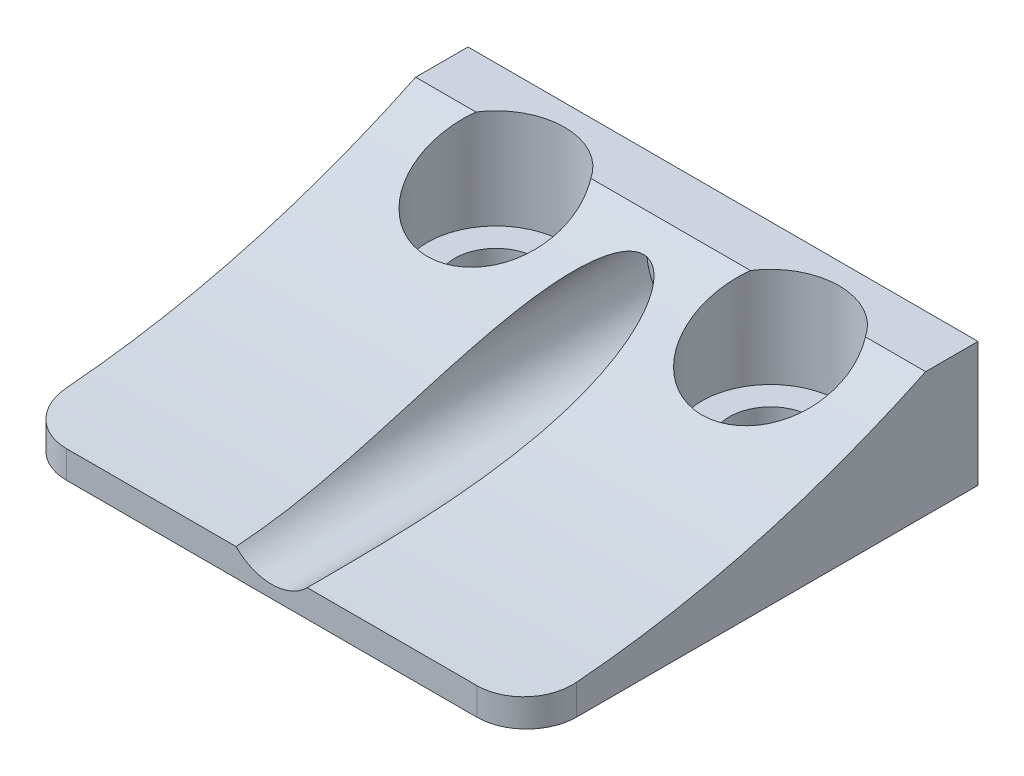
ISO-10303-21;
HEADER;
FILE_DESCRIPTION(('STEP AP214'),'2;1');
FILE_NAME('part.step','',(''),(''),'','','');
FILE_SCHEMA(('AUTOMOTIVE_DESIGN { 1 0 10303 214 1 1 1 1 }'));
ENDSEC;
DATA;
#1=APPLICATION_CONTEXT('core data for automotive mechanical design processes');
#2=APPLICATION_PROTOCOL_DEFINITION('international standard','automotive_design',2000,#1);
#3=PRODUCT_CONTEXT('',#1,'mechanical');
#4=PRODUCT('Part','Part','',(#3));
#5=PRODUCT_RELATED_PRODUCT_CATEGORY('part','',(#4));
#6=PRODUCT_DEFINITION_FORMATION('','',#4);
#7=PRODUCT_DEFINITION_CONTEXT('part definition',#1,'design');
#8=PRODUCT_DEFINITION('design','',#6,#7);
#9=PRODUCT_DEFINITION_SHAPE('','',#8);
#10=(LENGTH_UNIT() NAMED_UNIT(*) SI_UNIT(.MILLI.,.METRE.));
#11=(NAMED_UNIT(*) PLANE_ANGLE_UNIT() SI_UNIT($,.RADIAN.));
#12=(NAMED_UNIT(*) SI_UNIT($,.STERADIAN.) SOLID_ANGLE_UNIT());
#13=UNCERTAINTY_MEASURE_WITH_UNIT(LENGTH_MEASURE(1.E-05),#10,'distance_accuracy_value','');
#14=(GEOMETRIC_REPRESENTATION_CONTEXT(3) GLOBAL_UNCERTAINTY_ASSIGNED_CONTEXT((#13)) GLOBAL_UNIT_ASSIGNED_CONTEXT((#10,
#11,#12)) REPRESENTATION_CONTEXT('',''));
#15=CARTESIAN_POINT('',(0.,0.,0.));
#16=DIRECTION('',(0.,0.,1.));
#17=DIRECTION('',(1.,0.,0.));
#18=AXIS2_PLACEMENT_3D('',#15,#16,#17);
#19=CARTESIAN_POINT('',(26.8144544816881,41.0798408542344,10.3197737082196));
#20=DIRECTION('',(-1.,0.,0.));
#21=DIRECTION('',(0.,0.,1.));
#22=AXIS2_PLACEMENT_3D('',#19,#20,#21);
#23=CYLINDRICAL_SURFACE('',#22,40.);
#24=CARTESIAN_POINT('',(-10.225,41.0798408542344,10.3197737082196));
#25=DIRECTION('',(1.,0.,0.));
#26=DIRECTION('',(0.,0.,-1.));
#27=AXIS2_PLACEMENT_3D('',#24,#25,#26);
#28=CIRCLE('',#27,40.);
#29=CARTESIAN_POINT('',(-10.225,5.,-6.95));
#30=VERTEX_POINT('',#29);
#31=CARTESIAN_POINT('',(-10.225,1.21370760937314,7.05));
#32=VERTEX_POINT('',#31);
#33=EDGE_CURVE('E269',#30,#32,#28,.F.);
#34=ORIENTED_EDGE('',*,*,#33,.T.);
#35=CARTESIAN_POINT('',(-10.225,1.21370760937314,7.05));
#36=CARTESIAN_POINT('',(-10.224999565269,1.20909585036772,7.10621994124016));
#37=CARTESIAN_POINT('',(-10.2226279770161,1.2046066653164,7.16242321877067));
#38=CARTESIAN_POINT('',(-10.2131613711471,1.19589483553528,7.27444956414878));
#39=CARTESIAN_POINT('',(-10.2060664907608,1.19167218306558,7.330272642995));
#40=CARTESIAN_POINT('',(-10.1777543630685,1.17944838853864,7.49648393095205));
#41=CARTESIAN_POINT('',(-10.1495094883465,1.17187695426911,7.60579095520703));
#42=CARTESIAN_POINT('',(-10.0750218784631,1.15799943716217,7.81818524735456));
#43=CARTESIAN_POINT('',(-10.0287688553663,1.15169408075327,7.92126892093522));
#44=CARTESIAN_POINT('',(-9.91956076375945,1.14034941223615,8.11823871763709));
#45=CARTESIAN_POINT('',(-9.85660937024634,1.13530982203117,8.2121268583043));
#46=CARTESIAN_POINT('',(-9.71593411931338,1.12642693325025,8.38781758096311));
#47=CARTESIAN_POINT('',(-9.63824241378423,1.12258107812708,8.46964579063515));
#48=CARTESIAN_POINT('',(-9.47017869703432,1.11593922463981,8.6191327553429));
#49=CARTESIAN_POINT('',(-9.3798041310868,1.11314343821072,8.68678864876765));
#50=CARTESIAN_POINT('',(-9.18905553707292,1.1084536656538,8.80591436014459));
#51=CARTESIAN_POINT('',(-9.08869051600929,1.10655887596997,8.85739858686994));
#52=CARTESIAN_POINT('',(-8.88075570199277,1.10352648950776,8.94277481571343));
#53=CARTESIAN_POINT('',(-8.77319020049853,1.10238844605689,8.97667719298262));
#54=CARTESIAN_POINT('',(-8.59163817626508,1.10104239240878,9.01749320600612));
#55=CARTESIAN_POINT('',(-8.51879388746574,1.10064925249004,9.02967584877185));
#56=CARTESIAN_POINT('',(-8.37230991015651,1.10012929471929,9.04592818474137));
#57=CARTESIAN_POINT('',(-8.29867149869278,1.10000209929868,9.05000937937264));
#58=CARTESIAN_POINT('',(-8.225,1.09999999999999,9.05));
#59=B_SPLINE_CURVE_WITH_KNOTS('',3,(#35,#36,#37,#38,#39,#40,#41,#42,#43,#44,#45,#46,#47,#48,#49,
#50,#51,#52,#53,#54,#55,#56,#57,#58),.UNSPECIFIED.,.F.,.F.,(4,2,2,2,2,2,2,2,2,2,2,4),(0.,
0.169123231588352,0.338241549712069,0.675952878848622,1.0138574239882,1.35168766431087,
1.68878932168249,2.02595897964928,2.36282736546034,2.69949673644177,2.92064791953666,
3.14148491453194),.UNSPECIFIED.);
#60=CARTESIAN_POINT('',(-8.225,1.1,9.05));
#61=VERTEX_POINT('',#60);
#62=EDGE_CURVE('E60',#32,#61,#59,.T.);
#63=ORIENTED_EDGE('',*,*,#62,.T.);
#64=DIRECTION('',(-1.,0.,0.));
#65=VECTOR('',#64,1.);
#66=CARTESIAN_POINT('',(26.8144544816881,1.1,9.05));
#67=LINE('',#66,#65);
#68=CARTESIAN_POINT('',(-1.42828568570857,1.1,9.05));
#69=VERTEX_POINT('',#68);
#70=EDGE_CURVE('E146',#69,#61,#67,.T.);
#71=ORIENTED_EDGE('',*,*,#70,.F.);
#72=CARTESIAN_POINT('',(-1.42828568570857,1.1,9.04999999999998));
#73=CARTESIAN_POINT('',(-1.43345831726101,1.10528274764739,8.88366578477089));
#74=CARTESIAN_POINT('',(-1.43960156534336,1.11160261980214,8.71739886352551));
#75=CARTESIAN_POINT('',(-1.45364659543174,1.12631210238598,8.38503648361444));
#76=CARTESIAN_POINT('',(-1.46154831550012,1.13470163991756,8.21894101911658));
#77=CARTESIAN_POINT('',(-1.4876159165999,1.1629665966577,7.72098577616618));
#78=CARTESIAN_POINT('',(-1.50814544695503,1.18593951471559,7.38942083783333));
#79=CARTESIAN_POINT('',(-1.55383778322959,1.24029696100988,6.72496628677546));
#80=CARTESIAN_POINT('',(-1.57903200545506,1.27173922497099,6.39208363986475));
#81=CARTESIAN_POINT('',(-1.63191601341477,1.34292792190875,5.72744861248274));
#82=CARTESIAN_POINT('',(-1.65960561303224,1.38267373585932,5.39569614962934));
#83=CARTESIAN_POINT('',(-1.743745960221,1.51495301943622,4.39759259258863));
#84=CARTESIAN_POINT('',(-1.80090305923371,1.62015976457516,3.73290598740112));
#85=CARTESIAN_POINT('',(-1.87587225788762,1.8032467940516,2.73935473840345));
#86=CARTESIAN_POINT('',(-1.89907952105383,1.86854088719541,2.40853016683811));
#87=CARTESIAN_POINT('',(-1.93977903138408,2.00755297126522,1.74830286964103));
#88=CARTESIAN_POINT('',(-1.95727166314166,2.08127039485191,1.41890004979864));
#89=CARTESIAN_POINT('',(-1.98417149373306,2.23680153712152,0.763025925678702));
#90=CARTESIAN_POINT('',(-1.99361012399729,2.31858237973707,0.436548191361649));
#91=CARTESIAN_POINT('',(-2.0018258407399,2.49039026087254,-0.21434160815485));
#92=CARTESIAN_POINT('',(-2.00060436576562,2.58041618512248,-0.538753946160288));
#93=CARTESIAN_POINT('',(-1.98416220533394,2.76834631543846,-1.18422737234577));
#94=CARTESIAN_POINT('',(-1.9689731389906,2.86623227176228,-1.50529437397032));
#95=CARTESIAN_POINT('',(-1.93225750325255,3.01874142609825,-1.9839153586153));
#96=CARTESIAN_POINT('',(-1.91770185105954,3.07051207977863,-2.14292323299014));
#97=CARTESIAN_POINT('',(-1.88316120295797,3.17585866861077,-2.45974040831774));
#98=CARTESIAN_POINT('',(-1.86317698671937,3.22943434355166,-2.61754987804649));
#99=CARTESIAN_POINT('',(-1.82721804829365,3.31383926036287,-2.86117941131167));
#100=CARTESIAN_POINT('',(-1.81346732910393,3.34408906063101,-2.94753103957428));
#101=CARTESIAN_POINT('',(-1.78381938859837,3.4050616678414,-3.11969628963927));
#102=CARTESIAN_POINT('',(-1.767922183316,3.43578447124896,-3.20550991545531));
#103=CARTESIAN_POINT('',(-1.71665242199466,3.52865131126534,-3.46214432768812));
#104=CARTESIAN_POINT('',(-1.6777189839569,3.59145171831719,-3.63203731350148));
#105=CARTESIAN_POINT('',(-1.58812690150938,3.71814793187251,-3.96784190068478));
#106=CARTESIAN_POINT('',(-1.53750028959664,3.78204031208811,-4.13376303652438));
#107=CARTESIAN_POINT('',(-1.45010606986131,3.87805813160157,-4.3783572144136));
#108=CARTESIAN_POINT('',(-1.41908601093897,3.91007611768269,-4.4591303553968));
#109=CARTESIAN_POINT('',(-1.35259101019348,3.97398464588677,-4.6188613803396));
#110=CARTESIAN_POINT('',(-1.31711761635361,4.00587522833999,-4.69781988384027));
#111=CARTESIAN_POINT('',(-1.24917687676714,4.06238963826521,-4.83650017354847));
#112=CARTESIAN_POINT('',(-1.21772220776435,4.08709152790516,-4.89668481621298));
#113=CARTESIAN_POINT('',(-1.15109486101141,4.13605998851927,-5.01519168113801));
#114=CARTESIAN_POINT('',(-1.11592096064959,4.16032641325886,-5.0735132827117));
#115=CARTESIAN_POINT('',(-1.0414196598229,4.20803839319925,-5.18744981341687));
#116=CARTESIAN_POINT('',(-1.0021091624353,4.23148680482393,-5.24307449755149));
#117=CARTESIAN_POINT('',(-0.918540678230515,4.27723150771583,-5.35094321830111));
#118=CARTESIAN_POINT('',(-0.874287434024683,4.29952887388302,-5.4031904209067));
#119=CARTESIAN_POINT('',(-0.784043466693336,4.34052038686223,-5.49872165103629));
#120=CARTESIAN_POINT('',(-0.738531528249398,4.35935944697161,-5.54239008361488));
#121=CARTESIAN_POINT('',(-0.641945766257033,4.39487581983737,-5.62435798838894));
#122=CARTESIAN_POINT('',(-0.590865571066904,4.41155060725766,-5.66265119278162));
#123=CARTESIAN_POINT('',(-0.481959382384046,4.44189555566455,-5.73209286775474));
#124=CARTESIAN_POINT('',(-0.424043721309748,4.45551691314017,-5.76312559327037));
#125=CARTESIAN_POINT('',(-0.302667171812502,4.47791563562314,-5.81403746543239));
#126=CARTESIAN_POINT('',(-0.239228643648722,4.48671156883164,-5.83395937143424));
#127=CARTESIAN_POINT('',(-0.128866085902907,4.49636416666584,-5.85580436553776));
#128=CARTESIAN_POINT('',(-0.0827939039144372,4.49882259946486,-5.86136052528585));
#129=CARTESIAN_POINT('',(0.00971761957873079,4.50050982733777,-5.86517450679411));
#130=CARTESIAN_POINT('',(0.0561568570970288,4.49973950653721,-5.86343432650185));
#131=CARTESIAN_POINT('',(0.147919031716032,4.49505122958689,-5.85283271165214));
#132=CARTESIAN_POINT('',(0.193244307972157,4.49114057762425,-5.84398780217582));
#133=CARTESIAN_POINT('',(0.281838875681935,4.48054621485097,-5.819984716319));
#134=CARTESIAN_POINT('',(0.325106595927557,4.47386042159441,-5.80482179891823));
#135=CARTESIAN_POINT('',(0.427987986397958,4.45465368655782,-5.76116081309164));
#136=CARTESIAN_POINT('',(0.486112930613233,4.44086155108058,-5.72973374977497));
#137=CARTESIAN_POINT('',(0.596280401001137,4.40990782451347,-5.65888413503976));
#138=CARTESIAN_POINT('',(0.648306153953162,4.39273727406901,-5.61944031428224));
#139=CARTESIAN_POINT('',(0.739322013484568,4.35886904436732,-5.54124045318868));
#140=CARTESIAN_POINT('',(0.779100882907556,4.34247930515494,-5.50325093973279));
#141=CARTESIAN_POINT('',(0.854953178683813,4.30852977758407,-5.42419467162673));
#142=CARTESIAN_POINT('',(0.891023773097572,4.29096911163637,-5.38312560596795));
#143=CARTESIAN_POINT('',(0.994403302595701,4.2370203969623,-5.25632905590302));
#144=CARTESIAN_POINT('',(1.05677713660415,4.19940662148313,-5.16710650897162));
#145=CARTESIAN_POINT('',(1.1747683731275,4.12026523123181,-4.9773190119255));
#146=CARTESIAN_POINT('',(1.22971709521284,4.07864008072712,-4.87639365451039));
#147=CARTESIAN_POINT('',(1.33051703101936,3.99466452524144,-4.67029300781556));
#148=CARTESIAN_POINT('',(1.37635795330129,3.95231335790794,-4.56511307068149));
#149=CARTESIAN_POINT('',(1.46070459861849,3.86745189406069,-4.3516725286342));
#150=CARTESIAN_POINT('',(1.49919486130271,3.82494144979725,-4.24340596929308));
#151=CARTESIAN_POINT('',(1.56998247929754,3.74023894823175,-4.02483750607417));
#152=CARTESIAN_POINT('',(1.60228285525493,3.69804674533531,-3.91453662389705));
#153=CARTESIAN_POINT('',(1.6793587249136,3.58926144023566,-3.62627515771558));
#154=CARTESIAN_POINT('',(1.72012837687746,3.5230803337256,-3.44709014601791));
#155=CARTESIAN_POINT('',(1.79127477763523,3.39265656986616,-3.08593629898127));
#156=CARTESIAN_POINT('',(1.82164628912416,3.32841490417807,-2.90396610887423));
#157=CARTESIAN_POINT('',(1.87395740829673,3.20211223293134,-2.53772453838192));
#158=CARTESIAN_POINT('',(1.89588216030466,3.14005524219268,-2.3534496868659));
#159=CARTESIAN_POINT('',(1.93268108731261,3.01843664764704,-1.98337465392338));
#160=CARTESIAN_POINT('',(1.94755449277604,2.95887531684593,-1.79757430826463));
#161=CARTESIAN_POINT('',(1.97146899940612,2.84190873141882,-1.42327958364731));
#162=CARTESIAN_POINT('',(1.980462082028,2.78452474663924,-1.23477556322814));
#163=CARTESIAN_POINT('',(1.99334262481752,2.67250495855853,-0.856782925367288));
#164=CARTESIAN_POINT('',(1.99722990238961,2.61786925360952,-0.667294272956145));
#165=CARTESIAN_POINT('',(2.00240242931624,2.45828023642312,-0.0980113524981178));
#166=CARTESIAN_POINT('',(1.99722182324333,2.35751195684811,0.283025655949766));
#167=CARTESIAN_POINT('',(1.9754493581197,2.17562827611849,1.01430846793045));
#168=CARTESIAN_POINT('',(1.9598869446393,2.09356623210469,1.36435636248168));
#169=CARTESIAN_POINT('',(1.92135349252679,1.93897696213034,2.06617517340787));
#170=CARTESIAN_POINT('',(1.89838167326923,1.86645074195999,2.41794626748485));
#171=CARTESIAN_POINT('',(1.84762383783641,1.73089366696528,3.12328474745598));
#172=CARTESIAN_POINT('',(1.8198334878335,1.66787145636359,3.4768534698627));
#173=CARTESIAN_POINT('',(1.76192507792078,1.55139679002774,4.18536284822354));
#174=CARTESIAN_POINT('',(1.73180705892793,1.49794416612926,4.54030347995739));
#175=CARTESIAN_POINT('',(1.67268104936572,1.40218342083921,5.23999831740106));
#176=CARTESIAN_POINT('',(1.6436686767473,1.35957063916993,5.58471047591311));
#177=CARTESIAN_POINT('',(1.58805582524072,1.28332165310016,6.27530386978143));
#178=CARTESIAN_POINT('',(1.56145520845525,1.24968493525995,6.62118503712266));
#179=CARTESIAN_POINT('',(1.51298575499004,1.19144563664299,7.31369200369941));
#180=CARTESIAN_POINT('',(1.49111203265032,1.16683370943502,7.66031665648456));
#181=CARTESIAN_POINT('',(1.46340653472574,1.13668550066841,8.1809491415989));
#182=CARTESIAN_POINT('',(1.45502149555564,1.12776369387548,8.35463073256831));
#183=CARTESIAN_POINT('',(1.44016528608077,1.11218313603623,8.7021835175167));
#184=CARTESIAN_POINT('',(1.43369418967658,1.10552447237223,8.87605471855676));
#185=CARTESIAN_POINT('',(1.42828568570856,1.09999999999999,9.04999999999998));
#186=B_SPLINE_CURVE_WITH_KNOTS('',3,(#72,#73,#74,#75,#76,#77,#78,#79,#80,#81,#82,#83,#84,#85,
#86,#87,#88,#89,#90,#91,#92,#93,#94,#95,#96,#97,#98,#99,#100,#101,#102,#103,#104,#105,#106,#107,
#108,#109,#110,#111,#112,#113,#114,#115,#116,#117,#118,#119,#120,#121,#122,#123,#124,#125,#126,
#127,#128,#129,#130,#131,#132,#133,#134,#135,#136,#137,#138,#139,#140,#141,#142,#143,#144,#145,
#146,#147,#148,#149,#150,#151,#152,#153,#154,#155,#156,#157,#158,#159,#160,#161,#162,#163,#164,
#165,#166,#167,#168,#169,#170,#171,#172,#173,#174,#175,#176,#177,#178,#179,#180,#181,#182,#183,
#184,#185),.UNSPECIFIED.,.F.,.F.,(4,2,2,2,2,2,2,2,2,2,2,2,2,2,2,2,2,2,2,2,2,2,2,2,2,2,2,2,2,2,2,
2,2,2,2,2,2,2,2,2,2,2,2,2,2,2,2,2,2,2,2,2,2,2,2,2,4),(0.,0.499482147816068,0.99894670544052,
1.99776682538096,3.00357623251553,4.00931068373155,6.03438665064098,7.04828487685722,
8.06211485386563,9.07196993723258,10.0816887459706,11.0891274172057,11.5926175132957,
12.0960353345209,12.3735837902008,12.6511301728104,13.2066111804486,13.7605881722062,
14.0372695666372,14.3138550512825,14.5305425789178,14.747301560351,14.9632068899984,
15.178906807851,15.3760089505351,15.5733390488347,15.7736281013304,15.9731409380708,
16.1119158628408,16.2506527895305,16.3890679554314,16.5275871753808,16.7289434747596,
16.9308411366303,17.1027782924433,17.2748457929732,17.6194124905322,17.9855797982665,
18.3521585358511,18.719499991521,19.0866617265717,19.6721912727907,20.2580153044341,
20.844864996841,21.4317787193461,22.023427213744,22.6150968663023,23.7970979048847,
24.8765092338695,25.9560343224956,27.0365354299582,28.1170175481397,29.1625355265725,
30.2079936875187,31.252366051939,31.7746813758343,32.2970168645806),.UNSPECIFIED.);
#187=CARTESIAN_POINT('',(1.42828568570857,1.1,9.05));
#188=VERTEX_POINT('',#187);
#189=EDGE_CURVE('E133',#69,#188,#186,.T.);
#190=ORIENTED_EDGE('',*,*,#189,.T.);
#191=CARTESIAN_POINT('',(8.225,1.1,9.05));
#192=VERTEX_POINT('',#191);
#193=EDGE_CURVE('E148',#192,#188,#67,.T.);
#194=ORIENTED_EDGE('',*,*,#193,.F.);
#195=CARTESIAN_POINT('',(8.225,1.1,9.05));
#196=CARTESIAN_POINT('',(8.28123783851203,1.10000069503902,9.0499996382922));
#197=CARTESIAN_POINT('',(8.33744873846571,1.10007530672296,9.04762648841839));
#198=CARTESIAN_POINT('',(8.44946837304841,1.10037741223221,9.03815911289762));
#199=CARTESIAN_POINT('',(8.5052771266349,1.10060489880261,9.03106511128635));
#200=CARTESIAN_POINT('',(8.6714033194526,1.10152324484657,9.00276931999208));
#201=CARTESIAN_POINT('',(8.78060808405966,1.1024499605363,8.97455355666232));
#202=CARTESIAN_POINT('',(8.99272515975659,1.10502144070092,8.90020327600323));
#203=CARTESIAN_POINT('',(9.09563440136396,1.10666655230974,8.85406009721191));
#204=CARTESIAN_POINT('',(9.29223683963945,1.11080785059379,8.74517625611684));
#205=CARTESIAN_POINT('',(9.38593166768358,1.11330388626545,8.68243853909462));
#206=CARTESIAN_POINT('',(9.56143895958839,1.1192976158693,8.54216382752869));
#207=CARTESIAN_POINT('',(9.64325260899734,1.12279520975864,8.46462831135371));
#208=CARTESIAN_POINT('',(9.7927121362278,1.13093316543048,8.29695289907444));
#209=CARTESIAN_POINT('',(9.86035544211567,1.1355737343323,8.20681071978882));
#210=CARTESIAN_POINT('',(9.97956896871098,1.14609611400183,8.0164915418668));
#211=CARTESIAN_POINT('',(10.031133376255,1.15197837240392,7.91631093119329));
#212=CARTESIAN_POINT('',(10.1167030856152,1.16501071217477,7.70881382339418));
#213=CARTESIAN_POINT('',(10.1507177766453,1.17216011285752,7.60150117671851));
#214=CARTESIAN_POINT('',(10.1919583462806,1.18504847008534,7.41962777386215));
#215=CARTESIAN_POINT('',(10.2043445049042,1.19045474735005,7.34617117026092));
#216=CARTESIAN_POINT('',(10.2208643091675,1.20173833010579,7.19848023793793));
#217=CARTESIAN_POINT('',(10.225009912454,1.20761494019989,7.124247193476));
#218=CARTESIAN_POINT('',(10.225,1.21370760937315,7.05));
#219=B_SPLINE_CURVE_WITH_KNOTS('',3,(#195,#196,#197,#198,#199,#200,#201,#202,#203,#204,#205,
#206,#207,#208,#209,#210,#211,#212,#213,#214,#215,#216,#217,#218),.UNSPECIFIED.,.F.,.F.,(4,2,2,
2,2,2,2,2,2,2,2,4),(0.,0.168609898512986,0.337211795939221,0.673860565553855,1.01067218651971,
1.34742406854207,1.6841423250847,2.02092164352848,2.35782258034014,2.69454308554064,
2.91818010889533,3.14149238103),.UNSPECIFIED.);
#220=CARTESIAN_POINT('',(10.225,1.21370760937314,7.05));
#221=VERTEX_POINT('',#220);
#222=EDGE_CURVE('E67',#192,#221,#219,.T.);
#223=ORIENTED_EDGE('',*,*,#222,.T.);
#224=CARTESIAN_POINT('',(10.225,41.0798408542344,10.3197737082196));
#225=DIRECTION('',(-1.,0.,0.));
#226=DIRECTION('',(0.,0.,1.));
#227=AXIS2_PLACEMENT_3D('',#224,#225,#226);
#228=CIRCLE('',#227,40.);
#229=CARTESIAN_POINT('',(10.225,5.,-6.95));
#230=VERTEX_POINT('',#229);
#231=EDGE_CURVE('E155',#230,#221,#228,.T.);
#232=ORIENTED_EDGE('',*,*,#231,.F.);
#233=DIRECTION('',(-1.,0.,0.));
#234=VECTOR('',#233,1.);
#235=CARTESIAN_POINT('',(26.8144544816881,5.,-6.95));
#236=LINE('',#235,#234);
#237=CARTESIAN_POINT('',(7.80988611432322,5.,-6.95000000000001));
#238=VERTEX_POINT('',#237);
#239=EDGE_CURVE('E153',#230,#238,#236,.T.);
#240=ORIENTED_EDGE('',*,*,#239,.T.);
#241=CARTESIAN_POINT('',(3.20011388567677,4.99999999999999,-6.94999999999999));
#242=CARTESIAN_POINT('',(3.10779866397329,4.93209165334479,-6.80822172851224));
#243=CARTESIAN_POINT('',(3.02926599130279,4.86167328361176,-6.65886943729974));
#244=CARTESIAN_POINT('',(2.90089500401192,4.71827662765504,-6.34950333377037));
#245=CARTESIAN_POINT('',(2.85104570987861,4.6452993323088,-6.18949362713602));
#246=CARTESIAN_POINT('',(2.78111000864243,4.49921359759096,-5.86323829092861));
#247=CARTESIAN_POINT('',(2.76101366958933,4.4261052101426,-5.69699476130129));
#248=CARTESIAN_POINT('',(2.75130655889453,4.28185682375574,-5.36274609269866));
#249=CARTESIAN_POINT('',(2.7616949708726,4.21071677215679,-5.19474100101797));
#250=CARTESIAN_POINT('',(2.81346903168424,4.07209813698924,-4.86112740656574));
#251=CARTESIAN_POINT('',(2.85498483936764,4.0046362076777,-4.6955319520169));
#252=CARTESIAN_POINT('',(2.9689540525298,3.87558636849556,-4.37286487243274));
#253=CARTESIAN_POINT('',(3.04140143687738,3.81399731826507,-4.21579159517644));
#254=CARTESIAN_POINT('',(3.21166029951945,3.70133062913292,-3.92348150839035));
#255=CARTESIAN_POINT('',(3.30802268686657,3.64988142328866,-3.78754560232227));
#256=CARTESIAN_POINT('',(3.52548475885381,3.5552168602135,-3.53378006505748));
#257=CARTESIAN_POINT('',(3.64657268183942,3.51199760690935,-3.41594187151093));
#258=CARTESIAN_POINT('',(3.90079902173721,3.43766455426554,-3.21084555192685));
#259=CARTESIAN_POINT('',(4.0324833819884,3.40591158251056,-3.12201594260594));
#260=CARTESIAN_POINT('',(4.31060916997589,3.35125255225742,-2.9678276477648));
#261=CARTESIAN_POINT('',(4.45704498763397,3.32834314638868,-2.90246008230535));
#262=CARTESIAN_POINT('',(4.75116963300586,3.29297689027877,-2.80103569337132));
#263=CARTESIAN_POINT('',(4.8982795953528,3.27998510189306,-2.76348269656799));
#264=CARTESIAN_POINT('',(5.19715973088041,3.26257987464164,-2.71308861110631));
#265=CARTESIAN_POINT('',(5.34892885612858,3.25816452092891,-2.70024200629715));
#266=CARTESIAN_POINT('',(5.64770580268482,3.25800305337454,-2.69977221051975));
#267=CARTESIAN_POINT('',(5.79471298154283,3.26198818611437,-2.71136707340704));
#268=CARTESIAN_POINT('',(6.0845550965828,3.27800640817164,-2.75776071223185));
#269=CARTESIAN_POINT('',(6.22739027816862,3.29003902312374,-2.79255812047623));
#270=CARTESIAN_POINT('',(6.50470691657403,3.32189108463112,-2.88399653283538));
#271=CARTESIAN_POINT('',(6.63920065903032,3.34169874840911,-2.94060448156159));
#272=CARTESIAN_POINT('',(6.89656499422387,3.38871253571866,-3.07365014378018));
#273=CARTESIAN_POINT('',(7.01943461347853,3.41591927816106,-3.15008951608733));
#274=CARTESIAN_POINT('',(7.25372254389466,3.47802549257966,-3.32251620269309));
#275=CARTESIAN_POINT('',(7.36474544404151,3.51311168069167,-3.41897272791181));
#276=CARTESIAN_POINT('',(7.56900774167376,3.58981460971624,-3.62691765461101));
#277=CARTESIAN_POINT('',(7.66224346542065,3.63143269648975,-3.73840915329515));
#278=CARTESIAN_POINT('',(7.83348189669691,3.7226473645022,-3.97908841003803));
#279=CARTESIAN_POINT('',(7.91046218419578,3.77254305668675,-4.10888946037476));
#280=CARTESIAN_POINT('',(8.04166798150675,3.87755676463947,-4.37753447200291));
#281=CARTESIAN_POINT('',(8.09588819145175,3.93267599309153,-4.51638053081195));
#282=CARTESIAN_POINT('',(8.1838258086445,4.05074220975812,-4.8087517421709));
#283=CARTESIAN_POINT('',(8.21595916757449,4.11396562250554,-4.96264159834229));
#284=CARTESIAN_POINT('',(8.25369584693908,4.24355056405972,-5.27240190254801));
#285=CARTESIAN_POINT('',(8.25928253453897,4.30991403398338,-5.42827353096404));
#286=CARTESIAN_POINT('',(8.2437993846098,4.44830493391069,-5.74766860509562));
#287=CARTESIAN_POINT('',(8.22105982963916,4.5204288450348,-5.91106919397246));
#288=CARTESIAN_POINT('',(8.14679723301123,4.66426443382293,-6.23125435224169));
#289=CARTESIAN_POINT('',(8.09530661366071,4.73597648407268,-6.38804616047509));
#290=CARTESIAN_POINT('',(7.99933559951567,4.83937644606437,-6.61052321143727));
#291=CARTESIAN_POINT('',(7.96558282419002,4.87214887363576,-6.68048474015352));
#292=CARTESIAN_POINT('',(7.89215120583807,4.93679300584378,-6.8174903987478));
#293=CARTESIAN_POINT('',(7.85248187854706,4.96866606082832,-6.88453899397435));
#294=CARTESIAN_POINT('',(7.80988611432323,4.99999999999999,-6.94999999999999));
#295=B_SPLINE_CURVE_WITH_KNOTS('',3,(#241,#242,#243,#244,#245,#246,#247,#248,#249,#250,#251,
#252,#253,#254,#255,#256,#257,#258,#259,#260,#261,#262,#263,#264,#265,#266,#267,#268,#269,#270,
#271,#272,#273,#274,#275,#276,#277,#278,#279,#280,#281,#282,#283,#284,#285,#286,#287,#288,#289,
#290,#291,#292,#293,#294),.UNSPECIFIED.,.F.,.F.,(4,2,2,2,2,2,2,2,2,2,2,2,2,2,2,2,2,2,2,2,2,2,2,
2,2,2,4),(0.,0.546021025867853,1.09183290482731,1.63746254307725,2.18307756952408,
2.73098689227693,3.27878960776272,3.79920608849536,4.31937558736238,4.80282565277004,
5.28609254805728,5.74097226142486,6.1957504028378,6.63620013334582,7.0766239034766,
7.51638278988413,7.95617847213027,8.40776716584491,8.85944902931807,9.33422195621584,
9.80910537656269,10.3152397326285,10.8216911657371,11.3594599516623,11.8966235219533,
12.1493239910751,12.4016223331753),.UNSPECIFIED.);
#296=CARTESIAN_POINT('',(3.20011388567679,5.,-6.95));
#297=VERTEX_POINT('',#296);
#298=EDGE_CURVE('E192',#297,#238,#295,.T.);
#299=ORIENTED_EDGE('',*,*,#298,.F.);
#300=CARTESIAN_POINT('',(-3.20011388567678,5.,-6.95000000000001));
#301=VERTEX_POINT('',#300);
#302=EDGE_CURVE('E157',#297,#301,#236,.T.);
#303=ORIENTED_EDGE('',*,*,#302,.T.);
#304=CARTESIAN_POINT('',(-7.80988611432323,4.99999999999999,-6.94999999999999));
#305=CARTESIAN_POINT('',(-7.90220133602671,4.93209165334477,-6.80822172851225));
#306=CARTESIAN_POINT('',(-7.98073400869721,4.86167328361175,-6.65886943729975));
#307=CARTESIAN_POINT('',(-8.10910499598808,4.71827662765503,-6.34950333377038));
#308=CARTESIAN_POINT('',(-8.15895429012139,4.6452993323088,-6.18949362713602));
#309=CARTESIAN_POINT('',(-8.22888999135757,4.49921359759097,-5.86323829092861));
#310=CARTESIAN_POINT('',(-8.24898633041067,4.4261052101426,-5.69699476130129));
#311=CARTESIAN_POINT('',(-8.25869344110547,4.28185682375574,-5.36274609269866));
#312=CARTESIAN_POINT('',(-8.2483050291274,4.21071677215679,-5.19474100101797));
#313=CARTESIAN_POINT('',(-8.19653096831576,4.07209813698924,-4.86112740656574));
#314=CARTESIAN_POINT('',(-8.15501516063236,4.00463620767769,-4.69553195201691));
#315=CARTESIAN_POINT('',(-8.04104594747021,3.87558636849555,-4.37286487243275));
#316=CARTESIAN_POINT('',(-7.96859856312263,3.81399731826507,-4.21579159517644));
#317=CARTESIAN_POINT('',(-7.79833970048055,3.70133062913293,-3.92348150839035));
#318=CARTESIAN_POINT('',(-7.70197731313343,3.64988142328866,-3.78754560232227));
#319=CARTESIAN_POINT('',(-7.4845152411462,3.5552168602135,-3.53378006505748));
#320=CARTESIAN_POINT('',(-7.36342731816059,3.51199760690935,-3.41594187151093));
#321=CARTESIAN_POINT('',(-7.1092009782628,3.43766455426554,-3.21084555192685));
#322=CARTESIAN_POINT('',(-6.97751661801161,3.40591158251056,-3.12201594260595));
#323=CARTESIAN_POINT('',(-6.69939083002411,3.35125255225742,-2.9678276477648));
#324=CARTESIAN_POINT('',(-6.55295501236603,3.32834314638868,-2.90246008230535));
#325=CARTESIAN_POINT('',(-6.25883036699414,3.29297689027876,-2.80103569337132));
#326=CARTESIAN_POINT('',(-6.11172040464721,3.27998510189306,-2.76348269656799));
#327=CARTESIAN_POINT('',(-5.81284026911959,3.26257987464165,-2.71308861110631));
#328=CARTESIAN_POINT('',(-5.66107114387143,3.25816452092891,-2.70024200629715));
#329=CARTESIAN_POINT('',(-5.36229419731518,3.25800305337455,-2.69977221051975));
#330=CARTESIAN_POINT('',(-5.21528701845718,3.26198818611437,-2.71136707340704));
#331=CARTESIAN_POINT('',(-4.9254449034172,3.27800640817164,-2.75776071223185));
#332=CARTESIAN_POINT('',(-4.78260972183139,3.29003902312374,-2.79255812047622));
#333=CARTESIAN_POINT('',(-4.50529308342598,3.32189108463112,-2.88399653283537));
#334=CARTESIAN_POINT('',(-4.37079934096968,3.34169874840912,-2.94060448156159));
#335=CARTESIAN_POINT('',(-4.11343500577613,3.38871253571866,-3.07365014378017));
#336=CARTESIAN_POINT('',(-3.99056538652147,3.41591927816106,-3.15008951608733));
#337=CARTESIAN_POINT('',(-3.75627745610535,3.47802549257966,-3.32251620269309));
#338=CARTESIAN_POINT('',(-3.64525455595849,3.51311168069167,-3.41897272791181));
#339=CARTESIAN_POINT('',(-3.44099225832624,3.58981460971624,-3.626917654611));
#340=CARTESIAN_POINT('',(-3.34775653457935,3.63143269648974,-3.73840915329515));
#341=CARTESIAN_POINT('',(-3.17651810330308,3.7226473645022,-3.97908841003803));
#342=CARTESIAN_POINT('',(-3.09953781580422,3.77254305668674,-4.10888946037476));
#343=CARTESIAN_POINT('',(-2.96833201849325,3.87755676463946,-4.37753447200291));
#344=CARTESIAN_POINT('',(-2.91411180854825,3.93267599309152,-4.51638053081195));
#345=CARTESIAN_POINT('',(-2.8261741913555,4.05074220975812,-4.8087517421709));
#346=CARTESIAN_POINT('',(-2.79404083242551,4.11396562250553,-4.96264159834229));
#347=CARTESIAN_POINT('',(-2.75630415306092,4.24355056405972,-5.272401902548));
#348=CARTESIAN_POINT('',(-2.75071746546103,4.30991403398337,-5.42827353096403));
#349=CARTESIAN_POINT('',(-2.7662006153902,4.44830493391069,-5.74766860509561));
#350=CARTESIAN_POINT('',(-2.78894017036084,4.5204288450348,-5.91106919397246));
#351=CARTESIAN_POINT('',(-2.86320276698877,4.66426443382293,-6.23125435224169));
#352=CARTESIAN_POINT('',(-2.91469338633929,4.73597648407268,-6.38804616047509));
#353=CARTESIAN_POINT('',(-3.01066440048432,4.83937644606437,-6.61052321143727));
#354=CARTESIAN_POINT('',(-3.04441717580998,4.87214887363576,-6.68048474015351));
#355=CARTESIAN_POINT('',(-3.11784879416193,4.93679300584378,-6.8174903987478));
#356=CARTESIAN_POINT('',(-3.15751812145293,4.96866606082832,-6.88453899397435));
#357=CARTESIAN_POINT('',(-3.20011388567677,4.99999999999999,-6.94999999999999));
#358=B_SPLINE_CURVE_WITH_KNOTS('',3,(#304,#305,#306,#307,#308,#309,#310,#311,#312,#313,#314,
#315,#316,#317,#318,#319,#320,#321,#322,#323,#324,#325,#326,#327,#328,#329,#330,#331,#332,#333,
#334,#335,#336,#337,#338,#339,#340,#341,#342,#343,#344,#345,#346,#347,#348,#349,#350,#351,#352,
#353,#354,#355,#356,#357),.UNSPECIFIED.,.F.,.F.,(4,2,2,2,2,2,2,2,2,2,2,2,2,2,2,2,2,2,2,2,2,2,2,
2,2,2,4),(0.,0.546021025867851,1.0918329048273,1.63746254307725,2.18307756952407,
2.73098689227693,3.27878960776271,3.79920608849536,4.31937558736237,4.80282565277004,
5.28609254805728,5.74097226142486,6.1957504028378,6.63620013334582,7.0766239034766,
7.51638278988413,7.95617847213027,8.40776716584491,8.85944902931807,9.33422195621584,
9.80910537656269,10.3152397326285,10.8216911657371,11.3594599516623,11.8966235219533,
12.1493239910751,12.4016223331753),.UNSPECIFIED.);
#359=CARTESIAN_POINT('',(-7.80988611432321,5.,-6.95));
#360=VERTEX_POINT('',#359);
#361=EDGE_CURVE('E140',#360,#301,#358,.T.);
#362=ORIENTED_EDGE('',*,*,#361,.F.);
#363=EDGE_CURVE('E159',#360,#30,#236,.T.);
#364=ORIENTED_EDGE('',*,*,#363,.T.);
#365=EDGE_LOOP('',(#34,#63,#71,#190,#194,#223,#232,#240,#299,#303,#362,#364));
#366=FACE_BOUND('',#365,.T.);
#367=ADVANCED_FACE('F51',(#366),#23,.F.);
#368=CARTESIAN_POINT('',(0.,2.5,-12.3026911934581));
#369=DIRECTION('',(0.,0.,1.));
#370=DIRECTION('',(1.,0.,0.));
#371=AXIS2_PLACEMENT_3D('',#368,#369,#370);
#372=CYLINDRICAL_SURFACE('',#371,1.15);
#373=CARTESIAN_POINT('',(0.,2.5,-9.05));
#374=DIRECTION('',(0.,0.,1.));
#375=DIRECTION('',(1.,0.,0.));
#376=AXIS2_PLACEMENT_3D('',#373,#374,#375);
#377=CIRCLE('',#376,1.15);
#378=CARTESIAN_POINT('',(1.15,2.5,-9.05));
#379=VERTEX_POINT('',#378);
#380=EDGE_CURVE('E275',#379,#379,#377,.F.);
#381=ORIENTED_EDGE('',*,*,#380,.T.);
#382=EDGE_LOOP('',(#381));
#383=FACE_BOUND('',#382,.T.);
#384=CARTESIAN_POINT('',(0.,2.5,-8.));
#385=DIRECTION('',(0.,0.,1.));
#386=DIRECTION('',(1.,0.,0.));
#387=AXIS2_PLACEMENT_3D('',#384,#385,#386);
#388=CIRCLE('',#387,1.15);
#389=CARTESIAN_POINT('',(1.15,2.5,-8.));
#390=VERTEX_POINT('',#389);
#391=EDGE_CURVE('E149',#390,#390,#388,.F.);
#392=ORIENTED_EDGE('',*,*,#391,.F.);
#393=EDGE_LOOP('',(#392));
#394=FACE_BOUND('',#393,.T.);
#395=ADVANCED_FACE('F230',(#383,#394),#372,.F.);
#396=CARTESIAN_POINT('',(5.505,-4.66690475583121,-5.45));
#397=DIRECTION('',(0.,1.,0.));
#398=DIRECTION('',(0.,0.,1.));
#399=AXIS2_PLACEMENT_3D('',#396,#397,#398);
#400=CYLINDRICAL_SURFACE('',#399,1.65);
#401=CARTESIAN_POINT('',(5.505,0.,-5.45));
#402=DIRECTION('',(0.,-1.,0.));
#403=DIRECTION('',(0.,0.,-1.));
#404=AXIS2_PLACEMENT_3D('',#401,#402,#403);
#405=CIRCLE('',#404,1.65);
#406=CARTESIAN_POINT('',(5.505,0.,-7.1));
#407=VERTEX_POINT('',#406);
#408=EDGE_CURVE('E166',#407,#407,#405,.F.);
#409=ORIENTED_EDGE('',*,*,#408,.F.);
#410=EDGE_LOOP('',(#409));
#411=FACE_BOUND('',#410,.T.);
#412=CARTESIAN_POINT('',(5.505,1.,-5.45));
#413=DIRECTION('',(0.,1.,0.));
#414=DIRECTION('',(0.,0.,1.));
#415=AXIS2_PLACEMENT_3D('',#412,#413,#414);
#416=CIRCLE('',#415,1.65);
#417=CARTESIAN_POINT('',(5.505,1.,-3.8));
#418=VERTEX_POINT('',#417);
#419=EDGE_CURVE('E267',#418,#418,#416,.F.);
#420=ORIENTED_EDGE('',*,*,#419,.F.);
#421=EDGE_LOOP('',(#420));
#422=FACE_BOUND('',#421,.T.);
#423=ADVANCED_FACE('F236',(#411,#422),#400,.F.);
#424=CARTESIAN_POINT('',(-5.505,-4.66690475583121,-5.45));
#425=DIRECTION('',(0.,1.,0.));
#426=DIRECTION('',(0.,0.,1.));
#427=AXIS2_PLACEMENT_3D('',#424,#425,#426);
#428=CYLINDRICAL_SURFACE('',#427,1.65);
#429=CARTESIAN_POINT('',(-5.505,0.,-5.45));
#430=DIRECTION('',(0.,-1.,0.));
#431=DIRECTION('',(0.,0.,-1.));
#432=AXIS2_PLACEMENT_3D('',#429,#430,#431);
#433=CIRCLE('',#432,1.65);
#434=CARTESIAN_POINT('',(-5.505,0.,-7.1));
#435=VERTEX_POINT('',#434);
#436=EDGE_CURVE('E162',#435,#435,#433,.F.);
#437=ORIENTED_EDGE('',*,*,#436,.F.);
#438=EDGE_LOOP('',(#437));
#439=FACE_BOUND('',#438,.T.);
#440=CARTESIAN_POINT('',(-5.505,1.,-5.45));
#441=DIRECTION('',(0.,1.,0.));
#442=DIRECTION('',(0.,0.,1.));
#443=AXIS2_PLACEMENT_3D('',#440,#441,#442);
#444=CIRCLE('',#443,1.65);
#445=CARTESIAN_POINT('',(-5.505,1.,-3.8));
#446=VERTEX_POINT('',#445);
#447=EDGE_CURVE('E265',#446,#446,#444,.F.);
#448=ORIENTED_EDGE('',*,*,#447,.F.);
#449=EDGE_LOOP('',(#448));
#450=FACE_BOUND('',#449,.T.);
#451=ADVANCED_FACE('F244',(#439,#450),#428,.F.);
#452=CARTESIAN_POINT('',(10.225,1.,9.05));
#453=DIRECTION('',(-1.,0.,0.));
#454=DIRECTION('',(0.,0.,1.));
#455=AXIS2_PLACEMENT_3D('',#452,#453,#454);
#456=PLANE('',#455);
#457=ORIENTED_EDGE('',*,*,#231,.T.);
#458=DIRECTION('',(0.,-1.,0.));
#459=VECTOR('',#458,1.);
#460=CARTESIAN_POINT('',(10.225,1.,7.05));
#461=LINE('',#460,#459);
#462=CARTESIAN_POINT('',(10.225,0.,7.05));
#463=VERTEX_POINT('',#462);
#464=EDGE_CURVE('E11',#221,#463,#461,.T.);
#465=ORIENTED_EDGE('',*,*,#464,.T.);
#466=DIRECTION('',(0.,0.,-1.));
#467=VECTOR('',#466,1.);
#468=CARTESIAN_POINT('',(10.225,0.,9.05));
#469=LINE('',#468,#467);
#470=CARTESIAN_POINT('',(10.225,0.,-9.05));
#471=VERTEX_POINT('',#470);
#472=EDGE_CURVE('E175',#463,#471,#469,.T.);
#473=ORIENTED_EDGE('',*,*,#472,.T.);
#474=DIRECTION('',(0.,-1.,0.));
#475=VECTOR('',#474,1.);
#476=CARTESIAN_POINT('',(10.225,1.,-9.05));
#477=LINE('',#476,#475);
#478=CARTESIAN_POINT('',(10.225,5.,-9.05));
#479=VERTEX_POINT('',#478);
#480=EDGE_CURVE('E189',#479,#471,#477,.T.);
#481=ORIENTED_EDGE('',*,*,#480,.F.);
#482=DIRECTION('',(0.,0.,-1.));
#483=VECTOR('',#482,1.);
#484=CARTESIAN_POINT('',(10.225,5.,-9.05));
#485=LINE('',#484,#483);
#486=EDGE_CURVE('E172',#230,#479,#485,.T.);
#487=ORIENTED_EDGE('',*,*,#486,.F.);
#488=EDGE_LOOP('',(#457,#465,#473,#481,#487));
#489=FACE_BOUND('',#488,.T.);
#490=ADVANCED_FACE('F302',(#489),#456,.F.);
#491=CARTESIAN_POINT('',(-10.225,1.,-9.05));
#492=DIRECTION('',(0.,0.,1.));
#493=DIRECTION('',(1.,0.,0.));
#494=AXIS2_PLACEMENT_3D('',#491,#492,#493);
#495=PLANE('',#494);
#496=ORIENTED_EDGE('',*,*,#380,.F.);
#497=EDGE_LOOP('',(#496));
#498=FACE_BOUND('',#497,.T.);
#499=DIRECTION('',(-1.,0.,0.));
#500=VECTOR('',#499,1.);
#501=CARTESIAN_POINT('',(-10.225,0.,-9.05));
#502=LINE('',#501,#500);
#503=CARTESIAN_POINT('',(-10.225,0.,-9.05));
#504=VERTEX_POINT('',#503);
#505=EDGE_CURVE('E179',#471,#504,#502,.T.);
#506=ORIENTED_EDGE('',*,*,#505,.T.);
#507=DIRECTION('',(0.,-1.,0.));
#508=VECTOR('',#507,1.);
#509=CARTESIAN_POINT('',(-10.225,1.,-9.05));
#510=LINE('',#509,#508);
#511=CARTESIAN_POINT('',(-10.225,5.,-9.05));
#512=VERTEX_POINT('',#511);
#513=EDGE_CURVE('E186',#512,#504,#510,.T.);
#514=ORIENTED_EDGE('',*,*,#513,.F.);
#515=DIRECTION('',(-1.,0.,0.));
#516=VECTOR('',#515,1.);
#517=CARTESIAN_POINT('',(17.436102550928,5.,-9.05));
#518=LINE('',#517,#516);
#519=EDGE_CURVE('E171',#479,#512,#518,.T.);
#520=ORIENTED_EDGE('',*,*,#519,.F.);
#521=ORIENTED_EDGE('',*,*,#480,.T.);
#522=EDGE_LOOP('',(#506,#514,#520,#521));
#523=FACE_BOUND('',#522,.T.);
#524=ADVANCED_FACE('F304',(#498,#523),#495,.F.);
#525=CARTESIAN_POINT('',(-10.225,1.,9.05));
#526=DIRECTION('',(1.,0.,0.));
#527=DIRECTION('',(0.,0.,-1.));
#528=AXIS2_PLACEMENT_3D('',#525,#526,#527);
#529=PLANE('',#528);
#530=DIRECTION('',(0.,0.,1.));
#531=VECTOR('',#530,1.);
#532=CARTESIAN_POINT('',(-10.225,0.,9.05));
#533=LINE('',#532,#531);
#534=CARTESIAN_POINT('',(-10.225,0.,7.05));
#535=VERTEX_POINT('',#534);
#536=EDGE_CURVE('E181',#504,#535,#533,.T.);
#537=ORIENTED_EDGE('',*,*,#536,.T.);
#538=DIRECTION('',(0.,-1.,0.));
#539=VECTOR('',#538,1.);
#540=CARTESIAN_POINT('',(-10.225,1.,7.05));
#541=LINE('',#540,#539);
#542=EDGE_CURVE('E75',#535,#32,#541,.F.);
#543=ORIENTED_EDGE('',*,*,#542,.T.);
#544=ORIENTED_EDGE('',*,*,#33,.F.);
#545=DIRECTION('',(0.,0.,-1.));
#546=VECTOR('',#545,1.);
#547=CARTESIAN_POINT('',(-10.225,5.,-9.05));
#548=LINE('',#547,#546);
#549=EDGE_CURVE('E165',#30,#512,#548,.T.);
#550=ORIENTED_EDGE('',*,*,#549,.T.);
#551=ORIENTED_EDGE('',*,*,#513,.T.);
#552=EDGE_LOOP('',(#537,#543,#544,#550,#551));
#553=FACE_BOUND('',#552,.T.);
#554=ADVANCED_FACE('F307',(#553),#529,.F.);
#555=CARTESIAN_POINT('',(-10.225,1.,9.05));
#556=DIRECTION('',(0.,0.,-1.));
#557=DIRECTION('',(-1.,0.,0.));
#558=AXIS2_PLACEMENT_3D('',#555,#556,#557);
#559=PLANE('',#558);
#560=ORIENTED_EDGE('',*,*,#70,.T.);
#561=DIRECTION('',(0.,-1.,0.));
#562=VECTOR('',#561,1.);
#563=CARTESIAN_POINT('',(-8.225,1.,9.05));
#564=LINE('',#563,#562);
#565=CARTESIAN_POINT('',(-8.225,0.,9.05));
#566=VERTEX_POINT('',#565);
#567=EDGE_CURVE('E282',#61,#566,#564,.T.);
#568=ORIENTED_EDGE('',*,*,#567,.T.);
#569=DIRECTION('',(1.,0.,0.));
#570=VECTOR('',#569,1.);
#571=CARTESIAN_POINT('',(-10.225,0.,9.05));
#572=LINE('',#571,#570);
#573=CARTESIAN_POINT('',(8.225,0.,9.05));
#574=VERTEX_POINT('',#573);
#575=EDGE_CURVE('E183',#566,#574,#572,.T.);
#576=ORIENTED_EDGE('',*,*,#575,.T.);
#577=DIRECTION('',(0.,-1.,0.));
#578=VECTOR('',#577,1.);
#579=CARTESIAN_POINT('',(8.225,1.,9.05));
#580=LINE('',#579,#578);
#581=EDGE_CURVE('E139',#574,#192,#580,.F.);
#582=ORIENTED_EDGE('',*,*,#581,.T.);
#583=ORIENTED_EDGE('',*,*,#193,.T.);
#584=CARTESIAN_POINT('',(0.,2.5,9.05));
#585=DIRECTION('',(0.,0.,-1.));
#586=DIRECTION('',(-1.,0.,0.));
#587=AXIS2_PLACEMENT_3D('',#584,#585,#586);
#588=CIRCLE('',#587,2.);
#589=EDGE_CURVE('E137',#188,#69,#588,.T.);
#590=ORIENTED_EDGE('',*,*,#589,.T.);
#591=EDGE_LOOP('',(#560,#568,#576,#582,#583,#590));
#592=FACE_BOUND('',#591,.T.);
#593=ADVANCED_FACE('F144',(#592),#559,.F.);
#594=CARTESIAN_POINT('',(0.,0.,0.));
#595=DIRECTION('',(0.,-1.,0.));
#596=DIRECTION('',(0.,0.,-1.));
#597=AXIS2_PLACEMENT_3D('',#594,#595,#596);
#598=PLANE('',#597);
#599=ORIENTED_EDGE('',*,*,#436,.T.);
#600=EDGE_LOOP('',(#599));
#601=FACE_BOUND('',#600,.T.);
#602=ORIENTED_EDGE('',*,*,#408,.T.);
#603=EDGE_LOOP('',(#602));
#604=FACE_BOUND('',#603,.T.);
#605=ORIENTED_EDGE('',*,*,#575,.F.);
#606=CARTESIAN_POINT('',(-8.225,0.,7.05));
#607=DIRECTION('',(0.,-1.,0.));
#608=DIRECTION('',(0.,0.,-1.));
#609=AXIS2_PLACEMENT_3D('',#606,#607,#608);
#610=CIRCLE('',#609,2.);
#611=EDGE_CURVE('E286',#566,#535,#610,.T.);
#612=ORIENTED_EDGE('',*,*,#611,.T.);
#613=ORIENTED_EDGE('',*,*,#536,.F.);
#614=ORIENTED_EDGE('',*,*,#505,.F.);
#615=ORIENTED_EDGE('',*,*,#472,.F.);
#616=CARTESIAN_POINT('',(8.225,0.,7.05));
#617=DIRECTION('',(0.,-1.,0.));
#618=DIRECTION('',(0.,0.,-1.));
#619=AXIS2_PLACEMENT_3D('',#616,#617,#618);
#620=CIRCLE('',#619,2.);
#621=EDGE_CURVE('E284',#463,#574,#620,.T.);
#622=ORIENTED_EDGE('',*,*,#621,.T.);
#623=EDGE_LOOP('',(#605,#612,#613,#614,#615,#622));
#624=FACE_BOUND('',#623,.T.);
#625=ADVANCED_FACE('F224',(#601,#604,#624),#598,.T.);
#626=CARTESIAN_POINT('',(17.436102550928,5.,-9.05));
#627=DIRECTION('',(0.,-1.,0.));
#628=DIRECTION('',(0.,0.,-1.));
#629=AXIS2_PLACEMENT_3D('',#626,#627,#628);
#630=PLANE('',#629);
#631=ORIENTED_EDGE('',*,*,#363,.F.);
#632=CARTESIAN_POINT('',(-5.505,5.,-5.45));
#633=DIRECTION('',(0.,1.,0.));
#634=DIRECTION('',(0.,0.,1.));
#635=AXIS2_PLACEMENT_3D('',#632,#633,#634);
#636=CIRCLE('',#635,2.75);
#637=EDGE_CURVE('E271',#301,#360,#636,.T.);
#638=ORIENTED_EDGE('',*,*,#637,.F.);
#639=ORIENTED_EDGE('',*,*,#302,.F.);
#640=CARTESIAN_POINT('',(5.505,5.,-5.45));
#641=DIRECTION('',(0.,1.,0.));
#642=DIRECTION('',(0.,0.,1.));
#643=AXIS2_PLACEMENT_3D('',#640,#641,#642);
#644=CIRCLE('',#643,2.75);
#645=EDGE_CURVE('E337',#238,#297,#644,.T.);
#646=ORIENTED_EDGE('',*,*,#645,.F.);
#647=ORIENTED_EDGE('',*,*,#239,.F.);
#648=ORIENTED_EDGE('',*,*,#486,.T.);
#649=ORIENTED_EDGE('',*,*,#519,.T.);
#650=ORIENTED_EDGE('',*,*,#549,.F.);
#651=EDGE_LOOP('',(#631,#638,#639,#646,#647,#648,#649,#650));
#652=FACE_BOUND('',#651,.T.);
#653=ADVANCED_FACE('F219',(#652),#630,.F.);
#654=CARTESIAN_POINT('',(5.505,1.,-5.45));
#655=DIRECTION('',(0.,1.,0.));
#656=DIRECTION('',(0.,0.,1.));
#657=AXIS2_PLACEMENT_3D('',#654,#655,#656);
#658=PLANE('',#657);
#659=CARTESIAN_POINT('',(5.505,1.,-5.45));
#660=DIRECTION('',(0.,1.,0.));
#661=DIRECTION('',(0.,0.,1.));
#662=AXIS2_PLACEMENT_3D('',#659,#660,#661);
#663=CIRCLE('',#662,2.75);
#664=CARTESIAN_POINT('',(5.505,1.,-2.7));
#665=VERTEX_POINT('',#664);
#666=EDGE_CURVE('E340',#665,#665,#663,.T.);
#667=ORIENTED_EDGE('',*,*,#666,.T.);
#668=EDGE_LOOP('',(#667));
#669=FACE_BOUND('',#668,.T.);
#670=ORIENTED_EDGE('',*,*,#419,.T.);
#671=EDGE_LOOP('',(#670));
#672=FACE_BOUND('',#671,.T.);
#673=ADVANCED_FACE('F213',(#669,#672),#658,.T.);
#674=CARTESIAN_POINT('',(5.505,1.,-5.45));
#675=DIRECTION('',(0.,1.,0.));
#676=DIRECTION('',(0.,0.,1.));
#677=AXIS2_PLACEMENT_3D('',#674,#675,#676);
#678=CYLINDRICAL_SURFACE('',#677,2.75);
#679=ORIENTED_EDGE('',*,*,#298,.T.);
#680=ORIENTED_EDGE('',*,*,#645,.T.);
#681=EDGE_LOOP('',(#679,#680));
#682=FACE_BOUND('',#681,.T.);
#683=ORIENTED_EDGE('',*,*,#666,.F.);
#684=EDGE_LOOP('',(#683));
#685=FACE_BOUND('',#684,.T.);
#686=ADVANCED_FACE('F209',(#682,#685),#678,.F.);
#687=CARTESIAN_POINT('',(-5.505,1.,-5.45));
#688=DIRECTION('',(0.,1.,0.));
#689=DIRECTION('',(0.,0.,1.));
#690=AXIS2_PLACEMENT_3D('',#687,#688,#689);
#691=PLANE('',#690);
#692=CARTESIAN_POINT('',(-5.505,1.,-5.45));
#693=DIRECTION('',(0.,1.,0.));
#694=DIRECTION('',(0.,0.,1.));
#695=AXIS2_PLACEMENT_3D('',#692,#693,#694);
#696=CIRCLE('',#695,2.75);
#697=CARTESIAN_POINT('',(-5.505,1.,-2.7));
#698=VERTEX_POINT('',#697);
#699=EDGE_CURVE('E262',#698,#698,#696,.T.);
#700=ORIENTED_EDGE('',*,*,#699,.T.);
#701=EDGE_LOOP('',(#700));
#702=FACE_BOUND('',#701,.T.);
#703=ORIENTED_EDGE('',*,*,#447,.T.);
#704=EDGE_LOOP('',(#703));
#705=FACE_BOUND('',#704,.T.);
#706=ADVANCED_FACE('F212',(#702,#705),#691,.T.);
#707=CARTESIAN_POINT('',(-5.505,1.,-5.45));
#708=DIRECTION('',(0.,1.,0.));
#709=DIRECTION('',(0.,0.,1.));
#710=AXIS2_PLACEMENT_3D('',#707,#708,#709);
#711=CYLINDRICAL_SURFACE('',#710,2.75);
#712=ORIENTED_EDGE('',*,*,#361,.T.);
#713=ORIENTED_EDGE('',*,*,#637,.T.);
#714=EDGE_LOOP('',(#712,#713));
#715=FACE_BOUND('',#714,.T.);
#716=ORIENTED_EDGE('',*,*,#699,.F.);
#717=EDGE_LOOP('',(#716));
#718=FACE_BOUND('',#717,.T.);
#719=ADVANCED_FACE('F215',(#715,#718),#711,.F.);
#720=CARTESIAN_POINT('',(0.,2.5,-8.));
#721=DIRECTION('',(0.,0.,1.));
#722=DIRECTION('',(1.,0.,0.));
#723=AXIS2_PLACEMENT_3D('',#720,#721,#722);
#724=PLANE('',#723);
#725=CARTESIAN_POINT('',(0.,2.5,-8.));
#726=DIRECTION('',(0.,0.,1.));
#727=DIRECTION('',(1.,0.,0.));
#728=AXIS2_PLACEMENT_3D('',#725,#726,#727);
#729=CIRCLE('',#728,2.);
#730=CARTESIAN_POINT('',(2.,2.5,-8.));
#731=VERTEX_POINT('',#730);
#732=EDGE_CURVE('E150',#731,#731,#729,.T.);
#733=ORIENTED_EDGE('',*,*,#732,.T.);
#734=EDGE_LOOP('',(#733));
#735=FACE_BOUND('',#734,.T.);
#736=ORIENTED_EDGE('',*,*,#391,.T.);
#737=EDGE_LOOP('',(#736));
#738=FACE_BOUND('',#737,.T.);
#739=ADVANCED_FACE('F257',(#735,#738),#724,.T.);
#740=CARTESIAN_POINT('',(0.,2.5,14.7068542494924));
#741=DIRECTION('',(0.,0.,-1.));
#742=DIRECTION('',(-1.,0.,0.));
#743=AXIS2_PLACEMENT_3D('',#740,#741,#742);
#744=CYLINDRICAL_SURFACE('',#743,2.);
#745=ORIENTED_EDGE('',*,*,#589,.F.);
#746=ORIENTED_EDGE('',*,*,#189,.F.);
#747=EDGE_LOOP('',(#745,#746));
#748=FACE_BOUND('',#747,.T.);
#749=ORIENTED_EDGE('',*,*,#732,.F.);
#750=EDGE_LOOP('',(#749));
#751=FACE_BOUND('',#750,.T.);
#752=ADVANCED_FACE('F135',(#748,#751),#744,.F.);
#753=CARTESIAN_POINT('',(-8.225,1.,7.05));
#754=DIRECTION('',(0.,-1.,0.));
#755=DIRECTION('',(0.,0.,-1.));
#756=AXIS2_PLACEMENT_3D('',#753,#754,#755);
#757=CYLINDRICAL_SURFACE('',#756,2.);
#758=ORIENTED_EDGE('',*,*,#62,.F.);
#759=ORIENTED_EDGE('',*,*,#542,.F.);
#760=ORIENTED_EDGE('',*,*,#611,.F.);
#761=ORIENTED_EDGE('',*,*,#567,.F.);
#762=EDGE_LOOP('',(#758,#759,#760,#761));
#763=FACE_BOUND('',#762,.T.);
#764=ADVANCED_FACE('F297',(#763),#757,.T.);
#765=CARTESIAN_POINT('',(8.225,1.,7.05));
#766=DIRECTION('',(0.,-1.,0.));
#767=DIRECTION('',(0.,0.,-1.));
#768=AXIS2_PLACEMENT_3D('',#765,#766,#767);
#769=CYLINDRICAL_SURFACE('',#768,2.);
#770=ORIENTED_EDGE('',*,*,#222,.F.);
#771=ORIENTED_EDGE('',*,*,#581,.F.);
#772=ORIENTED_EDGE('',*,*,#621,.F.);
#773=ORIENTED_EDGE('',*,*,#464,.F.);
#774=EDGE_LOOP('',(#770,#771,#772,#773));
#775=FACE_BOUND('',#774,.T.);
#776=ADVANCED_FACE('F53',(#775),#769,.T.);
#777=CLOSED_SHELL('',(#367,#395,#423,#451,#490,#524,#554,#593,#625,#653,#673,#686,#706,#719,
#739,#752,#764,#776));
#778=MANIFOLD_SOLID_BREP('B2',#777);
#779=ADVANCED_BREP_SHAPE_REPRESENTATION('',(#18,#778),#14);
#780=SHAPE_DEFINITION_REPRESENTATION(#9,#779);
ENDSEC;
END-ISO-10303-21;
